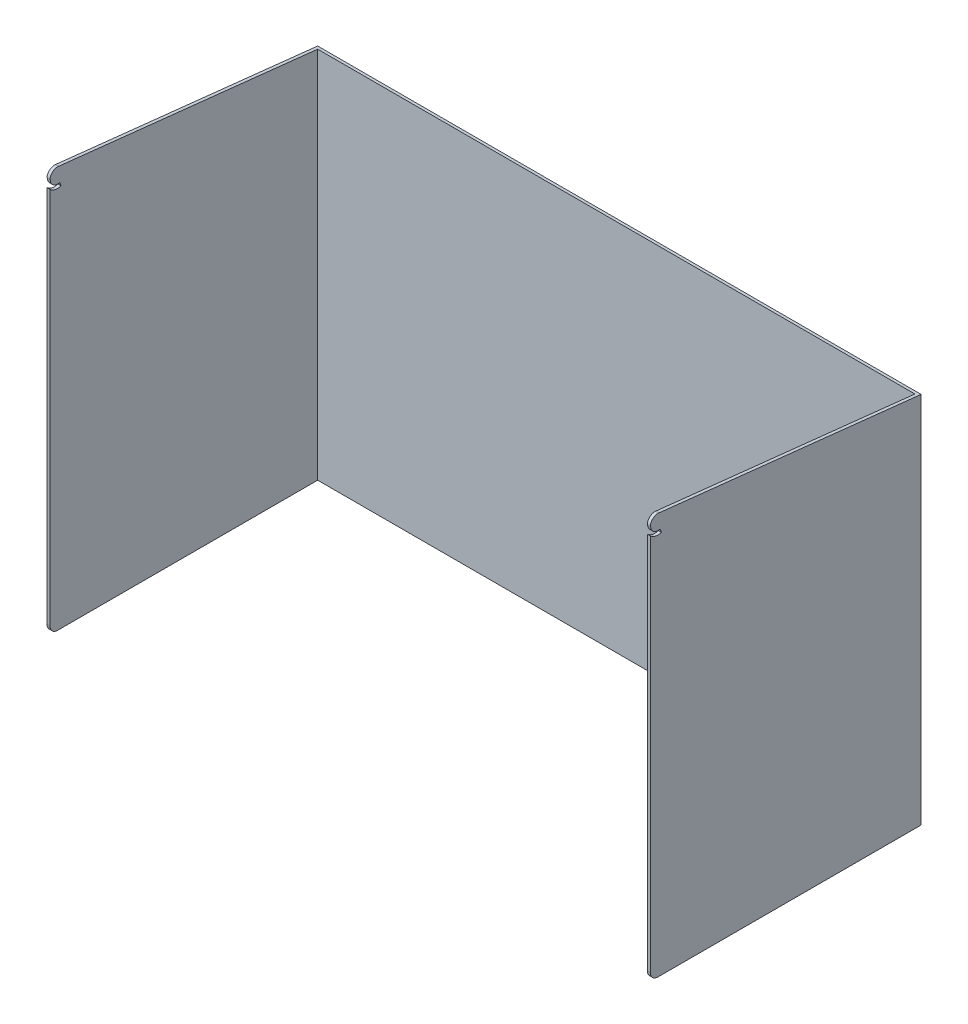
ISO-10303-21;
HEADER;
FILE_DESCRIPTION(('STEP AP214'),'2;1');
FILE_NAME('part.step','',(''),(''),'','','');
FILE_SCHEMA(('AUTOMOTIVE_DESIGN { 1 0 10303 214 1 1 1 1 }'));
ENDSEC;
DATA;
#1=APPLICATION_CONTEXT('core data for automotive mechanical design processes');
#2=APPLICATION_PROTOCOL_DEFINITION('international standard','automotive_design',2000,#1);
#3=PRODUCT_CONTEXT('',#1,'mechanical');
#4=PRODUCT('Part','Part','',(#3));
#5=PRODUCT_RELATED_PRODUCT_CATEGORY('part','',(#4));
#6=PRODUCT_DEFINITION_FORMATION('','',#4);
#7=PRODUCT_DEFINITION_CONTEXT('part definition',#1,'design');
#8=PRODUCT_DEFINITION('design','',#6,#7);
#9=PRODUCT_DEFINITION_SHAPE('','',#8);
#10=(LENGTH_UNIT() NAMED_UNIT(*) SI_UNIT(.MILLI.,.METRE.));
#11=(NAMED_UNIT(*) PLANE_ANGLE_UNIT() SI_UNIT($,.RADIAN.));
#12=(NAMED_UNIT(*) SI_UNIT($,.STERADIAN.) SOLID_ANGLE_UNIT());
#13=UNCERTAINTY_MEASURE_WITH_UNIT(LENGTH_MEASURE(1.E-05),#10,'distance_accuracy_value','');
#14=(GEOMETRIC_REPRESENTATION_CONTEXT(3) GLOBAL_UNCERTAINTY_ASSIGNED_CONTEXT((#13)) GLOBAL_UNIT_ASSIGNED_CONTEXT((#10,
#11,#12)) REPRESENTATION_CONTEXT('',''));
#15=CARTESIAN_POINT('',(0.,0.,0.));
#16=DIRECTION('',(0.,0.,1.));
#17=DIRECTION('',(1.,0.,0.));
#18=AXIS2_PLACEMENT_3D('',#15,#16,#17);
#19=CARTESIAN_POINT('',(360.,113.937005826671,32.4));
#20=DIRECTION('',(1.,0.,0.));
#21=DIRECTION('',(0.,0.,-1.));
#22=AXIS2_PLACEMENT_3D('',#19,#20,#21);
#23=PLANE('',#22);
#24=CARTESIAN_POINT('',(360.,113.937005826671,32.4));
#25=DIRECTION('',(1.,0.,0.));
#26=DIRECTION('',(0.,0.,-1.));
#27=AXIS2_PLACEMENT_3D('',#24,#25,#26);
#28=CIRCLE('',#27,4.74999999999996);
#29=CARTESIAN_POINT('',(360.,109.393275015609,31.015438583302));
#30=VERTEX_POINT('',#29);
#31=CARTESIAN_POINT('',(360.,114.091971809593,37.1474714895549));
#32=VERTEX_POINT('',#31);
#33=EDGE_CURVE('E86',#30,#32,#28,.F.);
#34=ORIENTED_EDGE('',*,*,#33,.T.);
#35=DIRECTION('',(0.,0.,1.));
#36=VECTOR('',#35,1.);
#37=CARTESIAN_POINT('',(360.,114.091971809593,32.4));
#38=LINE('',#37,#36);
#39=CARTESIAN_POINT('',(360.,114.091971809593,37.3975979774425));
#40=VERTEX_POINT('',#39);
#41=EDGE_CURVE('E250',#32,#40,#38,.T.);
#42=ORIENTED_EDGE('',*,*,#41,.T.);
#43=CARTESIAN_POINT('',(360.,113.937005826671,32.4));
#44=DIRECTION('',(1.,0.,0.));
#45=DIRECTION('',(0.,0.,-1.));
#46=AXIS2_PLACEMENT_3D('',#43,#44,#45);
#47=CIRCLE('',#46,5.00000000000001);
#48=CARTESIAN_POINT('',(360.,118.907830843486,31.8606497870554));
#49=VERTEX_POINT('',#48);
#50=EDGE_CURVE('E325',#49,#40,#47,.T.);
#51=ORIENTED_EDGE('',*,*,#50,.F.);
#52=DIRECTION('',(0.,0.10787004258892,0.994165003363056));
#53=VECTOR('',#52,1.);
#54=CARTESIAN_POINT('',(360.,118.907830843486,31.8606497870554));
#55=LINE('',#54,#53);
#56=CARTESIAN_POINT('',(360.,100.542515790759,-137.4));
#57=VERTEX_POINT('',#56);
#58=EDGE_CURVE('E302',#57,#49,#55,.T.);
#59=ORIENTED_EDGE('',*,*,#58,.F.);
#60=DIRECTION('',(0.,1.,0.));
#61=VECTOR('',#60,1.);
#62=CARTESIAN_POINT('',(360.,100.542515790759,-137.4));
#63=LINE('',#62,#61);
#64=CARTESIAN_POINT('',(360.,-143.211474761492,-137.4));
#65=VERTEX_POINT('',#64);
#66=EDGE_CURVE('E293',#65,#57,#63,.T.);
#67=ORIENTED_EDGE('',*,*,#66,.F.);
#68=DIRECTION('',(0.,0.,-1.));
#69=VECTOR('',#68,1.);
#70=CARTESIAN_POINT('',(360.,-143.211474761492,37.4));
#71=LINE('',#70,#69);
#72=CARTESIAN_POINT('',(360.,-143.211474761492,32.4));
#73=VERTEX_POINT('',#72);
#74=EDGE_CURVE('E314',#73,#65,#71,.T.);
#75=ORIENTED_EDGE('',*,*,#74,.F.);
#76=CARTESIAN_POINT('',(360.,-138.211474761492,32.4));
#77=DIRECTION('',(1.,0.,0.));
#78=DIRECTION('',(0.,0.,-1.));
#79=AXIS2_PLACEMENT_3D('',#76,#77,#78);
#80=CIRCLE('',#79,5.);
#81=CARTESIAN_POINT('',(360.,-138.211474761492,37.4));
#82=VERTEX_POINT('',#81);
#83=EDGE_CURVE('E188',#73,#82,#80,.F.);
#84=ORIENTED_EDGE('',*,*,#83,.T.);
#85=DIRECTION('',(0.,-1.,0.));
#86=VECTOR('',#85,1.);
#87=CARTESIAN_POINT('',(360.,113.937005826671,37.4));
#88=LINE('',#87,#86);
#89=CARTESIAN_POINT('',(360.,108.687005826591,37.4));
#90=VERTEX_POINT('',#89);
#91=EDGE_CURVE('E184',#90,#82,#88,.T.);
#92=ORIENTED_EDGE('',*,*,#91,.F.);
#93=CARTESIAN_POINT('',(360.,113.937005826969,32.4000000003966));
#94=DIRECTION('',(1.,0.,0.));
#95=DIRECTION('',(0.,0.,-1.));
#96=AXIS2_PLACEMENT_3D('',#93,#94,#95);
#97=CIRCLE('',#96,7.25000000000002);
#98=CARTESIAN_POINT('',(360.,107.038636307838,30.1695296514501));
#99=VERTEX_POINT('',#98);
#100=EDGE_CURVE('E213',#90,#99,#97,.T.);
#101=ORIENTED_EDGE('',*,*,#100,.T.);
#102=DIRECTION('',(0.,0.941111518688093,0.338096301950482));
#103=VECTOR('',#102,1.);
#104=CARTESIAN_POINT('',(360.,113.858164512135,32.6194595706312));
#105=LINE('',#104,#103);
#106=EDGE_CURVE('E216',#99,#30,#105,.T.);
#107=ORIENTED_EDGE('',*,*,#106,.T.);
#108=EDGE_LOOP('',(#34,#42,#51,#59,#67,#75,#84,#92,#101,#107));
#109=FACE_BOUND('',#108,.T.);
#110=ADVANCED_FACE('F37',(#109),#23,.F.);
#111=CARTESIAN_POINT('',(362.,100.325509474456,-139.4));
#112=DIRECTION('',(0.,0.,1.));
#113=DIRECTION('',(0.,-1.,0.));
#114=AXIS2_PLACEMENT_3D('',#111,#112,#113);
#115=PLANE('',#114);
#116=DIRECTION('',(-1.,0.,0.));
#117=VECTOR('',#116,1.);
#118=CARTESIAN_POINT('',(362.,-143.211474761492,-139.4));
#119=LINE('',#118,#117);
#120=CARTESIAN_POINT('',(362.,-143.211474761492,-139.4));
#121=VERTEX_POINT('',#120);
#122=CARTESIAN_POINT('',(-32.,-143.211474761492,-139.4));
#123=VERTEX_POINT('',#122);
#124=EDGE_CURVE('E322',#121,#123,#119,.T.);
#125=ORIENTED_EDGE('',*,*,#124,.T.);
#126=DIRECTION('',(0.,-1.,0.));
#127=VECTOR('',#126,1.);
#128=CARTESIAN_POINT('',(-32.,-143.211474761492,-139.4));
#129=LINE('',#128,#127);
#130=CARTESIAN_POINT('',(-32.,100.325509474456,-139.4));
#131=VERTEX_POINT('',#130);
#132=EDGE_CURVE('E255',#131,#123,#129,.T.);
#133=ORIENTED_EDGE('',*,*,#132,.F.);
#134=DIRECTION('',(-1.,0.,0.));
#135=VECTOR('',#134,1.);
#136=CARTESIAN_POINT('',(362.,100.325509474456,-139.4));
#137=LINE('',#136,#135);
#138=CARTESIAN_POINT('',(362.,100.325509474456,-139.4));
#139=VERTEX_POINT('',#138);
#140=EDGE_CURVE('E339',#139,#131,#137,.T.);
#141=ORIENTED_EDGE('',*,*,#140,.F.);
#142=DIRECTION('',(0.,1.,0.));
#143=VECTOR('',#142,1.);
#144=CARTESIAN_POINT('',(362.,100.325509474456,-139.4));
#145=LINE('',#144,#143);
#146=EDGE_CURVE('E309',#121,#139,#145,.T.);
#147=ORIENTED_EDGE('',*,*,#146,.F.);
#148=EDGE_LOOP('',(#125,#133,#141,#147));
#149=FACE_BOUND('',#148,.T.);
#150=ADVANCED_FACE('F372',(#149),#115,.F.);
#151=CARTESIAN_POINT('',(362.,118.907830843486,31.8606497870554));
#152=DIRECTION('',(0.,-0.994165003363056,0.10787004258892));
#153=DIRECTION('',(0.,-0.10787004258892,-0.994165003363056));
#154=AXIS2_PLACEMENT_3D('',#151,#152,#153);
#155=PLANE('',#154);
#156=ORIENTED_EDGE('',*,*,#140,.T.);
#157=DIRECTION('',(0.,-0.10787004258892,-0.994165003363056));
#158=VECTOR('',#157,1.);
#159=CARTESIAN_POINT('',(-32.,100.325509474456,-139.4));
#160=LINE('',#159,#158);
#161=CARTESIAN_POINT('',(-32.,118.907830843486,31.8606497870554));
#162=VERTEX_POINT('',#161);
#163=EDGE_CURVE('E271',#162,#131,#160,.T.);
#164=ORIENTED_EDGE('',*,*,#163,.F.);
#165=DIRECTION('',(1.,0.,0.));
#166=VECTOR('',#165,1.);
#167=CARTESIAN_POINT('',(-32.,118.907830843486,31.8606497870554));
#168=LINE('',#167,#166);
#169=CARTESIAN_POINT('',(-30.,118.907830843486,31.8606497870554));
#170=VERTEX_POINT('',#169);
#171=EDGE_CURVE('E275',#162,#170,#168,.T.);
#172=ORIENTED_EDGE('',*,*,#171,.T.);
#173=DIRECTION('',(0.,-0.10787004258892,-0.994165003363056));
#174=VECTOR('',#173,1.);
#175=CARTESIAN_POINT('',(-30.,100.325509474456,-139.4));
#176=LINE('',#175,#174);
#177=CARTESIAN_POINT('',(-30.,100.542515790759,-137.4));
#178=VERTEX_POINT('',#177);
#179=EDGE_CURVE('E260',#170,#178,#176,.T.);
#180=ORIENTED_EDGE('',*,*,#179,.T.);
#181=DIRECTION('',(1.,0.,0.));
#182=VECTOR('',#181,1.);
#183=CARTESIAN_POINT('',(-273.762195408039,100.542515790759,-137.4));
#184=LINE('',#183,#182);
#185=EDGE_CURVE('E297',#178,#57,#184,.T.);
#186=ORIENTED_EDGE('',*,*,#185,.T.);
#187=ORIENTED_EDGE('',*,*,#58,.T.);
#188=DIRECTION('',(-1.,0.,0.));
#189=VECTOR('',#188,1.);
#190=CARTESIAN_POINT('',(362.,118.907830843486,31.8606497870554));
#191=LINE('',#190,#189);
#192=CARTESIAN_POINT('',(362.,118.907830843486,31.8606497870554));
#193=VERTEX_POINT('',#192);
#194=EDGE_CURVE('E335',#193,#49,#191,.T.);
#195=ORIENTED_EDGE('',*,*,#194,.F.);
#196=DIRECTION('',(0.,0.10787004258892,0.994165003363056));
#197=VECTOR('',#196,1.);
#198=CARTESIAN_POINT('',(362.,118.907830843486,31.8606497870554));
#199=LINE('',#198,#197);
#200=EDGE_CURVE('E313',#139,#193,#199,.T.);
#201=ORIENTED_EDGE('',*,*,#200,.F.);
#202=EDGE_LOOP('',(#156,#164,#172,#180,#186,#187,#195,#201));
#203=FACE_BOUND('',#202,.T.);
#204=ADVANCED_FACE('F375',(#203),#155,.F.);
#205=CARTESIAN_POINT('',(362.,113.937005826671,32.4));
#206=DIRECTION('',(-1.,0.,0.));
#207=DIRECTION('',(0.,0.,1.));
#208=AXIS2_PLACEMENT_3D('',#205,#206,#207);
#209=CYLINDRICAL_SURFACE('',#208,5.00000000000001);
#210=ORIENTED_EDGE('',*,*,#50,.T.);
#211=DIRECTION('',(-1.,0.,0.));
#212=VECTOR('',#211,1.);
#213=CARTESIAN_POINT('',(362.,114.091971809593,37.3975979774425));
#214=LINE('',#213,#212);
#215=CARTESIAN_POINT('',(362.,114.091971809593,37.3975979774425));
#216=VERTEX_POINT('',#215);
#217=EDGE_CURVE('E210',#40,#216,#214,.F.);
#218=ORIENTED_EDGE('',*,*,#217,.T.);
#219=CARTESIAN_POINT('',(362.,113.937005826671,32.4));
#220=DIRECTION('',(1.,0.,0.));
#221=DIRECTION('',(0.,0.,-1.));
#222=AXIS2_PLACEMENT_3D('',#219,#220,#221);
#223=CIRCLE('',#222,5.00000000000001);
#224=EDGE_CURVE('E178',#193,#216,#223,.T.);
#225=ORIENTED_EDGE('',*,*,#224,.F.);
#226=ORIENTED_EDGE('',*,*,#194,.T.);
#227=EDGE_LOOP('',(#210,#218,#225,#226));
#228=FACE_BOUND('',#227,.T.);
#229=ADVANCED_FACE('F479',(#228),#209,.T.);
#230=CARTESIAN_POINT('',(362.,113.937005826671,37.4));
#231=DIRECTION('',(0.,0.,-1.));
#232=DIRECTION('',(0.,1.,0.));
#233=AXIS2_PLACEMENT_3D('',#230,#231,#232);
#234=PLANE('',#233);
#235=DIRECTION('',(0.,-1.,0.));
#236=VECTOR('',#235,1.);
#237=CARTESIAN_POINT('',(362.,113.937005826671,37.4));
#238=LINE('',#237,#236);
#239=CARTESIAN_POINT('',(362.,108.687005826591,37.4));
#240=VERTEX_POINT('',#239);
#241=CARTESIAN_POINT('',(362.,-138.211474761492,37.4));
#242=VERTEX_POINT('',#241);
#243=EDGE_CURVE('E167',#240,#242,#238,.T.);
#244=ORIENTED_EDGE('',*,*,#243,.F.);
#245=DIRECTION('',(1.,0.,0.));
#246=VECTOR('',#245,1.);
#247=CARTESIAN_POINT('',(-32.0005,108.687005826591,37.4));
#248=LINE('',#247,#246);
#249=EDGE_CURVE('E57',#90,#240,#248,.T.);
#250=ORIENTED_EDGE('',*,*,#249,.F.);
#251=ORIENTED_EDGE('',*,*,#91,.T.);
#252=DIRECTION('',(-1.,0.,0.));
#253=VECTOR('',#252,1.);
#254=CARTESIAN_POINT('',(362.,-138.211474761492,37.4));
#255=LINE('',#254,#253);
#256=EDGE_CURVE('E181',#82,#242,#255,.F.);
#257=ORIENTED_EDGE('',*,*,#256,.T.);
#258=EDGE_LOOP('',(#244,#250,#251,#257));
#259=FACE_BOUND('',#258,.T.);
#260=ADVANCED_FACE('F182',(#259),#234,.F.);
#261=CARTESIAN_POINT('',(362.,-143.211474761492,37.4));
#262=DIRECTION('',(0.,1.,0.));
#263=DIRECTION('',(0.,0.,1.));
#264=AXIS2_PLACEMENT_3D('',#261,#262,#263);
#265=PLANE('',#264);
#266=DIRECTION('',(0.,0.,1.));
#267=VECTOR('',#266,1.);
#268=CARTESIAN_POINT('',(-30.,-143.211474761492,37.4));
#269=LINE('',#268,#267);
#270=CARTESIAN_POINT('',(-30.,-143.211474761492,-137.4));
#271=VERTEX_POINT('',#270);
#272=CARTESIAN_POINT('',(-30.,-143.211474761492,32.4));
#273=VERTEX_POINT('',#272);
#274=EDGE_CURVE('E254',#271,#273,#269,.T.);
#275=ORIENTED_EDGE('',*,*,#274,.T.);
#276=DIRECTION('',(1.,0.,0.));
#277=VECTOR('',#276,1.);
#278=CARTESIAN_POINT('',(362.,-143.211474761492,32.4));
#279=LINE('',#278,#277);
#280=CARTESIAN_POINT('',(-32.,-143.211474761492,32.4));
#281=VERTEX_POINT('',#280);
#282=EDGE_CURVE('E351',#273,#281,#279,.F.);
#283=ORIENTED_EDGE('',*,*,#282,.T.);
#284=DIRECTION('',(0.,0.,1.));
#285=VECTOR('',#284,1.);
#286=CARTESIAN_POINT('',(-32.,-143.211474761492,37.4));
#287=LINE('',#286,#285);
#288=EDGE_CURVE('E259',#123,#281,#287,.T.);
#289=ORIENTED_EDGE('',*,*,#288,.F.);
#290=ORIENTED_EDGE('',*,*,#124,.F.);
#291=DIRECTION('',(0.,0.,-1.));
#292=VECTOR('',#291,1.);
#293=CARTESIAN_POINT('',(362.,-143.211474761492,37.4));
#294=LINE('',#293,#292);
#295=CARTESIAN_POINT('',(362.,-143.211474761492,32.4));
#296=VERTEX_POINT('',#295);
#297=EDGE_CURVE('E177',#296,#121,#294,.T.);
#298=ORIENTED_EDGE('',*,*,#297,.F.);
#299=DIRECTION('',(-1.,0.,0.));
#300=VECTOR('',#299,1.);
#301=CARTESIAN_POINT('',(362.,-143.211474761492,32.4));
#302=LINE('',#301,#300);
#303=EDGE_CURVE('E192',#296,#73,#302,.T.);
#304=ORIENTED_EDGE('',*,*,#303,.T.);
#305=ORIENTED_EDGE('',*,*,#74,.T.);
#306=DIRECTION('',(1.,0.,0.));
#307=VECTOR('',#306,1.);
#308=CARTESIAN_POINT('',(-273.762195408039,-143.211474761492,-137.4));
#309=LINE('',#308,#307);
#310=EDGE_CURVE('E292',#271,#65,#309,.T.);
#311=ORIENTED_EDGE('',*,*,#310,.F.);
#312=EDGE_LOOP('',(#275,#283,#289,#290,#298,#304,#305,#311));
#313=FACE_BOUND('',#312,.T.);
#314=ADVANCED_FACE('F363',(#313),#265,.F.);
#315=CARTESIAN_POINT('',(362.,113.937005826671,32.4));
#316=DIRECTION('',(1.,0.,0.));
#317=DIRECTION('',(0.,0.,-1.));
#318=AXIS2_PLACEMENT_3D('',#315,#316,#317);
#319=PLANE('',#318);
#320=DIRECTION('',(0.,0.,1.));
#321=VECTOR('',#320,1.);
#322=CARTESIAN_POINT('',(362.,114.091971809593,32.4));
#323=LINE('',#322,#321);
#324=CARTESIAN_POINT('',(362.,114.091971809593,37.1474714895549));
#325=VERTEX_POINT('',#324);
#326=EDGE_CURVE('E207',#325,#216,#323,.T.);
#327=ORIENTED_EDGE('',*,*,#326,.F.);
#328=CARTESIAN_POINT('',(362.,113.937005826671,32.4));
#329=DIRECTION('',(1.,0.,0.));
#330=DIRECTION('',(0.,0.,-1.));
#331=AXIS2_PLACEMENT_3D('',#328,#329,#330);
#332=CIRCLE('',#331,4.74999999999996);
#333=CARTESIAN_POINT('',(362.,109.393275015609,31.015438583302));
#334=VERTEX_POINT('',#333);
#335=EDGE_CURVE('E41',#334,#325,#332,.F.);
#336=ORIENTED_EDGE('',*,*,#335,.F.);
#337=DIRECTION('',(0.,0.941111518688093,0.338096301950482));
#338=VECTOR('',#337,1.);
#339=CARTESIAN_POINT('',(362.,109.393275015609,31.015438583302));
#340=LINE('',#339,#338);
#341=CARTESIAN_POINT('',(362.,107.038636307838,30.1695296514501));
#342=VERTEX_POINT('',#341);
#343=EDGE_CURVE('E75',#342,#334,#340,.T.);
#344=ORIENTED_EDGE('',*,*,#343,.F.);
#345=CARTESIAN_POINT('',(362.,113.937005826969,32.4000000003966));
#346=DIRECTION('',(1.,0.,0.));
#347=DIRECTION('',(0.,0.,-1.));
#348=AXIS2_PLACEMENT_3D('',#345,#346,#347);
#349=CIRCLE('',#348,7.25000000000002);
#350=EDGE_CURVE('E174',#240,#342,#349,.T.);
#351=ORIENTED_EDGE('',*,*,#350,.F.);
#352=ORIENTED_EDGE('',*,*,#243,.T.);
#353=CARTESIAN_POINT('',(362.,-138.211474761492,32.4));
#354=DIRECTION('',(1.,0.,0.));
#355=DIRECTION('',(0.,0.,-1.));
#356=AXIS2_PLACEMENT_3D('',#353,#354,#355);
#357=CIRCLE('',#356,5.);
#358=EDGE_CURVE('E172',#242,#296,#357,.T.);
#359=ORIENTED_EDGE('',*,*,#358,.T.);
#360=ORIENTED_EDGE('',*,*,#297,.T.);
#361=ORIENTED_EDGE('',*,*,#146,.T.);
#362=ORIENTED_EDGE('',*,*,#200,.T.);
#363=ORIENTED_EDGE('',*,*,#224,.T.);
#364=EDGE_LOOP('',(#327,#336,#344,#351,#352,#359,#360,#361,#362,#363));
#365=FACE_BOUND('',#364,.T.);
#366=ADVANCED_FACE('F170',(#365),#319,.T.);
#367=CARTESIAN_POINT('',(-273.762195408039,100.542515790759,-137.4));
#368=DIRECTION('',(0.,0.,-1.));
#369=DIRECTION('',(0.,1.,0.));
#370=AXIS2_PLACEMENT_3D('',#367,#368,#369);
#371=PLANE('',#370);
#372=DIRECTION('',(0.,1.,0.));
#373=VECTOR('',#372,1.);
#374=CARTESIAN_POINT('',(-30.,100.542515790759,-137.4));
#375=LINE('',#374,#373);
#376=EDGE_CURVE('E298',#271,#178,#375,.T.);
#377=ORIENTED_EDGE('',*,*,#376,.F.);
#378=ORIENTED_EDGE('',*,*,#310,.T.);
#379=ORIENTED_EDGE('',*,*,#66,.T.);
#380=ORIENTED_EDGE('',*,*,#185,.F.);
#381=EDGE_LOOP('',(#377,#378,#379,#380));
#382=FACE_BOUND('',#381,.T.);
#383=ADVANCED_FACE('F388',(#382),#371,.F.);
#384=CARTESIAN_POINT('',(-32.,113.937005826671,37.4));
#385=DIRECTION('',(0.,0.,-1.));
#386=DIRECTION('',(0.,1.,0.));
#387=AXIS2_PLACEMENT_3D('',#384,#385,#386);
#388=PLANE('',#387);
#389=DIRECTION('',(0.,1.,0.));
#390=VECTOR('',#389,1.);
#391=CARTESIAN_POINT('',(-30.,113.937005826671,37.4));
#392=LINE('',#391,#390);
#393=CARTESIAN_POINT('',(-30.,-138.211474761492,37.4));
#394=VERTEX_POINT('',#393);
#395=CARTESIAN_POINT('',(-30.,108.687005826591,37.4));
#396=VERTEX_POINT('',#395);
#397=EDGE_CURVE('E279',#394,#396,#392,.T.);
#398=ORIENTED_EDGE('',*,*,#397,.T.);
#399=CARTESIAN_POINT('',(-32.,108.687005826591,37.4));
#400=VERTEX_POINT('',#399);
#401=EDGE_CURVE('E399',#400,#396,#248,.T.);
#402=ORIENTED_EDGE('',*,*,#401,.F.);
#403=DIRECTION('',(0.,1.,0.));
#404=VECTOR('',#403,1.);
#405=CARTESIAN_POINT('',(-32.,113.937005826671,37.4));
#406=LINE('',#405,#404);
#407=CARTESIAN_POINT('',(-32.,-138.211474761492,37.4));
#408=VERTEX_POINT('',#407);
#409=EDGE_CURVE('E264',#408,#400,#406,.T.);
#410=ORIENTED_EDGE('',*,*,#409,.F.);
#411=DIRECTION('',(1.,0.,0.));
#412=VECTOR('',#411,1.);
#413=CARTESIAN_POINT('',(-32.,-138.211474761492,37.4));
#414=LINE('',#413,#412);
#415=EDGE_CURVE('E342',#408,#394,#414,.T.);
#416=ORIENTED_EDGE('',*,*,#415,.T.);
#417=EDGE_LOOP('',(#398,#402,#410,#416));
#418=FACE_BOUND('',#417,.T.);
#419=ADVANCED_FACE('F397',(#418),#388,.F.);
#420=CARTESIAN_POINT('',(-32.,113.937005826671,32.4));
#421=DIRECTION('',(1.,0.,0.));
#422=DIRECTION('',(0.,0.,-1.));
#423=AXIS2_PLACEMENT_3D('',#420,#421,#422);
#424=CYLINDRICAL_SURFACE('',#423,5.);
#425=CARTESIAN_POINT('',(-32.,113.937005826671,32.4));
#426=DIRECTION('',(-1.,0.,0.));
#427=DIRECTION('',(0.,0.,-1.));
#428=AXIS2_PLACEMENT_3D('',#425,#426,#427);
#429=CIRCLE('',#428,5.);
#430=CARTESIAN_POINT('',(-32.,114.091971809593,37.3975979774424));
#431=VERTEX_POINT('',#430);
#432=EDGE_CURVE('E268',#431,#162,#429,.T.);
#433=ORIENTED_EDGE('',*,*,#432,.F.);
#434=DIRECTION('',(1.,0.,0.));
#435=VECTOR('',#434,1.);
#436=CARTESIAN_POINT('',(-32.,114.091971809593,37.3975979774424));
#437=LINE('',#436,#435);
#438=CARTESIAN_POINT('',(-30.,114.091971809593,37.3975979774424));
#439=VERTEX_POINT('',#438);
#440=EDGE_CURVE('E240',#431,#439,#437,.T.);
#441=ORIENTED_EDGE('',*,*,#440,.T.);
#442=CARTESIAN_POINT('',(-30.,113.937005826671,32.4));
#443=DIRECTION('',(-1.,0.,0.));
#444=DIRECTION('',(0.,0.,-1.));
#445=AXIS2_PLACEMENT_3D('',#442,#443,#444);
#446=CIRCLE('',#445,5.);
#447=EDGE_CURVE('E283',#439,#170,#446,.T.);
#448=ORIENTED_EDGE('',*,*,#447,.T.);
#449=ORIENTED_EDGE('',*,*,#171,.F.);
#450=EDGE_LOOP('',(#433,#441,#448,#449));
#451=FACE_BOUND('',#450,.T.);
#452=ADVANCED_FACE('F380',(#451),#424,.T.);
#453=CARTESIAN_POINT('',(-32.,113.937005826671,32.4));
#454=DIRECTION('',(1.,0.,0.));
#455=DIRECTION('',(0.,0.,-1.));
#456=AXIS2_PLACEMENT_3D('',#453,#454,#455);
#457=PLANE('',#456);
#458=CARTESIAN_POINT('',(-32.,113.937005826671,32.4));
#459=DIRECTION('',(1.,0.,0.));
#460=DIRECTION('',(0.,0.,-1.));
#461=AXIS2_PLACEMENT_3D('',#458,#459,#460);
#462=CIRCLE('',#461,4.74999999999996);
#463=CARTESIAN_POINT('',(-32.,109.393275015609,31.015438583302));
#464=VERTEX_POINT('',#463);
#465=CARTESIAN_POINT('',(-32.,114.091971809593,37.1474714895549));
#466=VERTEX_POINT('',#465);
#467=EDGE_CURVE('E222',#464,#466,#462,.F.);
#468=ORIENTED_EDGE('',*,*,#467,.T.);
#469=DIRECTION('',(0.,0.,1.));
#470=VECTOR('',#469,1.);
#471=CARTESIAN_POINT('',(-32.,114.091971809593,32.4));
#472=LINE('',#471,#470);
#473=EDGE_CURVE('E211',#466,#431,#472,.T.);
#474=ORIENTED_EDGE('',*,*,#473,.T.);
#475=ORIENTED_EDGE('',*,*,#432,.T.);
#476=ORIENTED_EDGE('',*,*,#163,.T.);
#477=ORIENTED_EDGE('',*,*,#132,.T.);
#478=ORIENTED_EDGE('',*,*,#288,.T.);
#479=CARTESIAN_POINT('',(-32.,-138.211474761492,32.4));
#480=DIRECTION('',(1.,0.,0.));
#481=DIRECTION('',(0.,0.,-1.));
#482=AXIS2_PLACEMENT_3D('',#479,#480,#481);
#483=CIRCLE('',#482,5.);
#484=EDGE_CURVE('E354',#281,#408,#483,.F.);
#485=ORIENTED_EDGE('',*,*,#484,.T.);
#486=ORIENTED_EDGE('',*,*,#409,.T.);
#487=CARTESIAN_POINT('',(-32.,113.937005826969,32.4000000003966));
#488=DIRECTION('',(1.,0.,0.));
#489=DIRECTION('',(0.,0.,-1.));
#490=AXIS2_PLACEMENT_3D('',#487,#488,#489);
#491=CIRCLE('',#490,7.25000000000002);
#492=CARTESIAN_POINT('',(-32.,107.038636307838,30.1695296514501));
#493=VERTEX_POINT('',#492);
#494=EDGE_CURVE('E214',#400,#493,#491,.T.);
#495=ORIENTED_EDGE('',*,*,#494,.T.);
#496=DIRECTION('',(0.,0.941111518688093,0.338096301950482));
#497=VECTOR('',#496,1.);
#498=CARTESIAN_POINT('',(-32.,113.858164512135,32.6194595706312));
#499=LINE('',#498,#497);
#500=EDGE_CURVE('E217',#493,#464,#499,.T.);
#501=ORIENTED_EDGE('',*,*,#500,.T.);
#502=EDGE_LOOP('',(#468,#474,#475,#476,#477,#478,#485,#486,#495,#501));
#503=FACE_BOUND('',#502,.T.);
#504=ADVANCED_FACE('F376',(#503),#457,.F.);
#505=CARTESIAN_POINT('',(-30.,113.937005826671,32.4));
#506=DIRECTION('',(1.,0.,0.));
#507=DIRECTION('',(0.,0.,-1.));
#508=AXIS2_PLACEMENT_3D('',#505,#506,#507);
#509=PLANE('',#508);
#510=DIRECTION('',(0.,0.,1.));
#511=VECTOR('',#510,1.);
#512=CARTESIAN_POINT('',(-30.,114.091971809593,32.4));
#513=LINE('',#512,#511);
#514=CARTESIAN_POINT('',(-30.,114.091971809593,37.1474714895549));
#515=VERTEX_POINT('',#514);
#516=EDGE_CURVE('E11',#515,#439,#513,.T.);
#517=ORIENTED_EDGE('',*,*,#516,.F.);
#518=CARTESIAN_POINT('',(-30.,113.937005826671,32.4));
#519=DIRECTION('',(1.,0.,0.));
#520=DIRECTION('',(0.,0.,-1.));
#521=AXIS2_PLACEMENT_3D('',#518,#519,#520);
#522=CIRCLE('',#521,4.74999999999996);
#523=CARTESIAN_POINT('',(-30.,109.393275015609,31.015438583302));
#524=VERTEX_POINT('',#523);
#525=EDGE_CURVE('E48',#524,#515,#522,.F.);
#526=ORIENTED_EDGE('',*,*,#525,.F.);
#527=DIRECTION('',(0.,0.941111518688093,0.338096301950482));
#528=VECTOR('',#527,1.);
#529=CARTESIAN_POINT('',(-30.,113.858164512135,32.6194595706312));
#530=LINE('',#529,#528);
#531=CARTESIAN_POINT('',(-30.,107.038636307838,30.1695296514501));
#532=VERTEX_POINT('',#531);
#533=EDGE_CURVE('E199',#532,#524,#530,.T.);
#534=ORIENTED_EDGE('',*,*,#533,.F.);
#535=CARTESIAN_POINT('',(-30.,113.937005826969,32.4000000003966));
#536=DIRECTION('',(1.,0.,0.));
#537=DIRECTION('',(0.,0.,-1.));
#538=AXIS2_PLACEMENT_3D('',#535,#536,#537);
#539=CIRCLE('',#538,7.25000000000002);
#540=EDGE_CURVE('E194',#396,#532,#539,.T.);
#541=ORIENTED_EDGE('',*,*,#540,.F.);
#542=ORIENTED_EDGE('',*,*,#397,.F.);
#543=CARTESIAN_POINT('',(-30.,-138.211474761492,32.4));
#544=DIRECTION('',(1.,0.,0.));
#545=DIRECTION('',(0.,0.,-1.));
#546=AXIS2_PLACEMENT_3D('',#543,#544,#545);
#547=CIRCLE('',#546,5.);
#548=EDGE_CURVE('E346',#394,#273,#547,.T.);
#549=ORIENTED_EDGE('',*,*,#548,.T.);
#550=ORIENTED_EDGE('',*,*,#274,.F.);
#551=ORIENTED_EDGE('',*,*,#376,.T.);
#552=ORIENTED_EDGE('',*,*,#179,.F.);
#553=ORIENTED_EDGE('',*,*,#447,.F.);
#554=EDGE_LOOP('',(#517,#526,#534,#541,#542,#549,#550,#551,#552,#553));
#555=FACE_BOUND('',#554,.T.);
#556=ADVANCED_FACE('F385',(#555),#509,.T.);
#557=CARTESIAN_POINT('',(-32.,-138.211474761492,32.4));
#558=DIRECTION('',(1.,0.,0.));
#559=DIRECTION('',(0.,0.,-1.));
#560=AXIS2_PLACEMENT_3D('',#557,#558,#559);
#561=CYLINDRICAL_SURFACE('',#560,5.);
#562=ORIENTED_EDGE('',*,*,#484,.F.);
#563=ORIENTED_EDGE('',*,*,#282,.F.);
#564=ORIENTED_EDGE('',*,*,#548,.F.);
#565=ORIENTED_EDGE('',*,*,#415,.F.);
#566=EDGE_LOOP('',(#562,#563,#564,#565));
#567=FACE_BOUND('',#566,.T.);
#568=ADVANCED_FACE('F392',(#567),#561,.T.);
#569=CARTESIAN_POINT('',(362.,-138.211474761492,32.4));
#570=DIRECTION('',(-1.,0.,0.));
#571=DIRECTION('',(0.,0.,1.));
#572=AXIS2_PLACEMENT_3D('',#569,#570,#571);
#573=CYLINDRICAL_SURFACE('',#572,5.);
#574=ORIENTED_EDGE('',*,*,#358,.F.);
#575=ORIENTED_EDGE('',*,*,#256,.F.);
#576=ORIENTED_EDGE('',*,*,#83,.F.);
#577=ORIENTED_EDGE('',*,*,#303,.F.);
#578=EDGE_LOOP('',(#574,#575,#576,#577));
#579=FACE_BOUND('',#578,.T.);
#580=ADVANCED_FACE('F39',(#579),#573,.T.);
#581=CARTESIAN_POINT('',(-32.0005,113.937005826969,32.4000000003966));
#582=DIRECTION('',(1.,0.,0.));
#583=DIRECTION('',(0.,0.,-1.));
#584=AXIS2_PLACEMENT_3D('',#581,#582,#583);
#585=CYLINDRICAL_SURFACE('',#584,7.25000000000002);
#586=ORIENTED_EDGE('',*,*,#401,.T.);
#587=ORIENTED_EDGE('',*,*,#540,.T.);
#588=DIRECTION('',(1.,0.,0.));
#589=VECTOR('',#588,1.);
#590=CARTESIAN_POINT('',(-32.0005,107.038636307838,30.1695296514501));
#591=LINE('',#590,#589);
#592=EDGE_CURVE('E410',#493,#532,#591,.T.);
#593=ORIENTED_EDGE('',*,*,#592,.F.);
#594=ORIENTED_EDGE('',*,*,#494,.F.);
#595=EDGE_LOOP('',(#586,#587,#593,#594));
#596=FACE_BOUND('',#595,.T.);
#597=ADVANCED_FACE('F458',(#596),#585,.F.);
#598=CARTESIAN_POINT('',(-32.0005,109.393275015609,31.015438583302));
#599=DIRECTION('',(0.,0.338096301950482,-0.941111518688093));
#600=DIRECTION('',(0.,0.941111518688093,0.338096301950482));
#601=AXIS2_PLACEMENT_3D('',#598,#599,#600);
#602=PLANE('',#601);
#603=ORIENTED_EDGE('',*,*,#592,.T.);
#604=ORIENTED_EDGE('',*,*,#533,.T.);
#605=DIRECTION('',(1.,0.,0.));
#606=VECTOR('',#605,1.);
#607=CARTESIAN_POINT('',(-32.0005,109.393275015609,31.015438583302));
#608=LINE('',#607,#606);
#609=EDGE_CURVE('E426',#464,#524,#608,.T.);
#610=ORIENTED_EDGE('',*,*,#609,.F.);
#611=ORIENTED_EDGE('',*,*,#500,.F.);
#612=EDGE_LOOP('',(#603,#604,#610,#611));
#613=FACE_BOUND('',#612,.T.);
#614=ADVANCED_FACE('F446',(#613),#602,.F.);
#615=CARTESIAN_POINT('',(-32.0005,113.937005826671,32.4));
#616=DIRECTION('',(1.,0.,0.));
#617=DIRECTION('',(0.,0.,-1.));
#618=AXIS2_PLACEMENT_3D('',#615,#616,#617);
#619=CYLINDRICAL_SURFACE('',#618,4.74999999999996);
#620=ORIENTED_EDGE('',*,*,#609,.T.);
#621=ORIENTED_EDGE('',*,*,#525,.T.);
#622=DIRECTION('',(1.,0.,0.));
#623=VECTOR('',#622,1.);
#624=CARTESIAN_POINT('',(-32.0005,114.091971809593,37.1474714895549));
#625=LINE('',#624,#623);
#626=EDGE_CURVE('E414',#466,#515,#625,.T.);
#627=ORIENTED_EDGE('',*,*,#626,.F.);
#628=ORIENTED_EDGE('',*,*,#467,.F.);
#629=EDGE_LOOP('',(#620,#621,#627,#628));
#630=FACE_BOUND('',#629,.T.);
#631=ADVANCED_FACE('F448',(#630),#619,.T.);
#632=CARTESIAN_POINT('',(-32.0005,114.091971809593,37.3975979774424));
#633=DIRECTION('',(0.,1.,0.));
#634=DIRECTION('',(0.,0.,1.));
#635=AXIS2_PLACEMENT_3D('',#632,#633,#634);
#636=PLANE('',#635);
#637=ORIENTED_EDGE('',*,*,#626,.T.);
#638=ORIENTED_EDGE('',*,*,#516,.T.);
#639=ORIENTED_EDGE('',*,*,#440,.F.);
#640=ORIENTED_EDGE('',*,*,#473,.F.);
#641=EDGE_LOOP('',(#637,#638,#639,#640));
#642=FACE_BOUND('',#641,.T.);
#643=ADVANCED_FACE('F610',(#642),#636,.F.);
#644=EDGE_CURVE('E419',#32,#325,#625,.T.);
#645=ORIENTED_EDGE('',*,*,#644,.T.);
#646=ORIENTED_EDGE('',*,*,#326,.T.);
#647=ORIENTED_EDGE('',*,*,#217,.F.);
#648=ORIENTED_EDGE('',*,*,#41,.F.);
#649=EDGE_LOOP('',(#645,#646,#647,#648));
#650=FACE_BOUND('',#649,.T.);
#651=ADVANCED_FACE('F620',(#650),#636,.F.);
#652=EDGE_CURVE('E429',#30,#334,#608,.T.);
#653=ORIENTED_EDGE('',*,*,#652,.T.);
#654=ORIENTED_EDGE('',*,*,#335,.T.);
#655=ORIENTED_EDGE('',*,*,#644,.F.);
#656=ORIENTED_EDGE('',*,*,#33,.F.);
#657=EDGE_LOOP('',(#653,#654,#655,#656));
#658=FACE_BOUND('',#657,.T.);
#659=ADVANCED_FACE('F462',(#658),#619,.T.);
#660=EDGE_CURVE('E405',#99,#342,#591,.T.);
#661=ORIENTED_EDGE('',*,*,#660,.T.);
#662=ORIENTED_EDGE('',*,*,#343,.T.);
#663=ORIENTED_EDGE('',*,*,#652,.F.);
#664=ORIENTED_EDGE('',*,*,#106,.F.);
#665=EDGE_LOOP('',(#661,#662,#663,#664));
#666=FACE_BOUND('',#665,.T.);
#667=ADVANCED_FACE('F454',(#666),#602,.F.);
#668=ORIENTED_EDGE('',*,*,#249,.T.);
#669=ORIENTED_EDGE('',*,*,#350,.T.);
#670=ORIENTED_EDGE('',*,*,#660,.F.);
#671=ORIENTED_EDGE('',*,*,#100,.F.);
#672=EDGE_LOOP('',(#668,#669,#670,#671));
#673=FACE_BOUND('',#672,.T.);
#674=ADVANCED_FACE('F455',(#673),#585,.F.);
#675=CLOSED_SHELL('',(#110,#150,#204,#229,#260,#314,#366,#383,#419,#452,#504,#556,#568,#580,
#597,#614,#631,#643,#651,#659,#667,#674));
#676=MANIFOLD_SOLID_BREP('B2',#675);
#677=ADVANCED_BREP_SHAPE_REPRESENTATION('',(#18,#676),#14);
#678=SHAPE_DEFINITION_REPRESENTATION(#9,#677);
ENDSEC;
END-ISO-10303-21;
